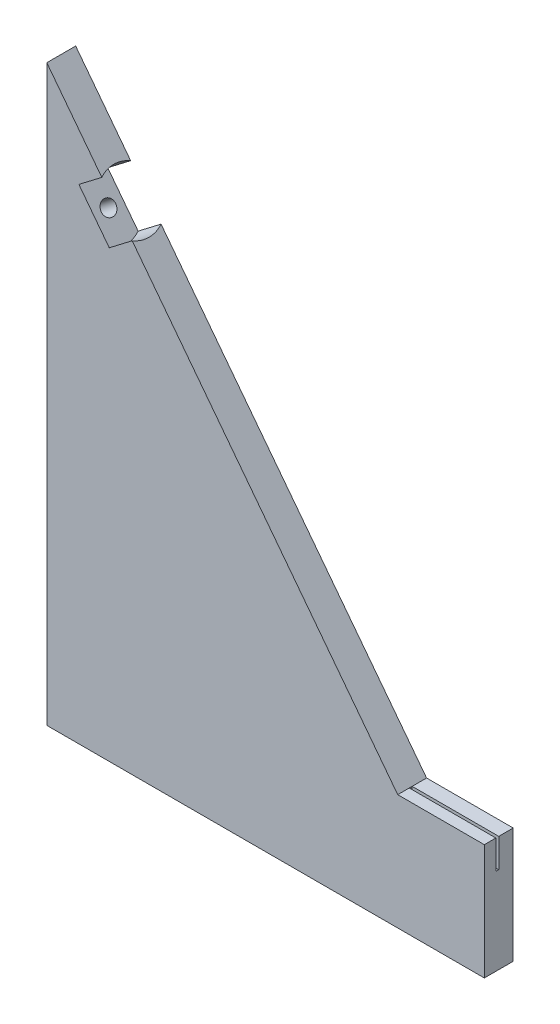
ISO-10303-21;
HEADER;
FILE_DESCRIPTION(('STEP AP214'),'2;1');
FILE_NAME('part.step','',(''),(''),'','','');
FILE_SCHEMA(('AUTOMOTIVE_DESIGN { 1 0 10303 214 1 1 1 1 }'));
ENDSEC;
DATA;
#1=APPLICATION_CONTEXT('core data for automotive mechanical design processes');
#2=APPLICATION_PROTOCOL_DEFINITION('international standard','automotive_design',2000,#1);
#3=PRODUCT_CONTEXT('',#1,'mechanical');
#4=PRODUCT('Part','Part','',(#3));
#5=PRODUCT_RELATED_PRODUCT_CATEGORY('part','',(#4));
#6=PRODUCT_DEFINITION_FORMATION('','',#4);
#7=PRODUCT_DEFINITION_CONTEXT('part definition',#1,'design');
#8=PRODUCT_DEFINITION('design','',#6,#7);
#9=PRODUCT_DEFINITION_SHAPE('','',#8);
#10=(LENGTH_UNIT() NAMED_UNIT(*) SI_UNIT(.MILLI.,.METRE.));
#11=(NAMED_UNIT(*) PLANE_ANGLE_UNIT() SI_UNIT($,.RADIAN.));
#12=(NAMED_UNIT(*) SI_UNIT($,.STERADIAN.) SOLID_ANGLE_UNIT());
#13=UNCERTAINTY_MEASURE_WITH_UNIT(LENGTH_MEASURE(1.E-05),#10,'distance_accuracy_value','');
#14=(GEOMETRIC_REPRESENTATION_CONTEXT(3) GLOBAL_UNCERTAINTY_ASSIGNED_CONTEXT((#13)) GLOBAL_UNIT_ASSIGNED_CONTEXT((#10,
#11,#12)) REPRESENTATION_CONTEXT('',''));
#15=CARTESIAN_POINT('',(0.,0.,0.));
#16=DIRECTION('',(0.,0.,1.));
#17=DIRECTION('',(1.,0.,0.));
#18=AXIS2_PLACEMENT_3D('',#15,#16,#17);
#19=CARTESIAN_POINT('',(61.7516378344646,-67.9802034253826,6.35));
#20=DIRECTION('',(-0.794096490407309,-0.60779171096914,0.));
#21=DIRECTION('',(0.60779171096914,-0.794096490407309,0.));
#22=AXIS2_PLACEMENT_3D('',#19,#20,#21);
#23=PLANE('',#22);
#24=DIRECTION('',(-0.60779171096914,0.794096490407309,0.));
#25=VECTOR('',#24,1.);
#26=CARTESIAN_POINT('',(61.7516378344646,-67.9802034253826,6.35));
#27=LINE('',#26,#25);
#28=CARTESIAN_POINT('',(-3.34240544312143,17.0669441093048,6.35));
#29=VERTEX_POINT('',#28);
#30=CARTESIAN_POINT('',(-15.4379094586162,32.8700508563456,6.35));
#31=VERTEX_POINT('',#30);
#32=EDGE_CURVE('E141',#29,#31,#27,.T.);
#33=ORIENTED_EDGE('',*,*,#32,.F.);
#34=CARTESIAN_POINT('',(0.,12.7,3.175));
#35=DIRECTION('',(0.794096490407309,0.60779171096914,0.));
#36=DIRECTION('',(-0.60779171096914,0.794096490407309,0.));
#37=AXIS2_PLACEMENT_3D('',#34,#35,#36);
#38=CIRCLE('',#37,6.35);
#39=CARTESIAN_POINT('',(-3.34240544312143,17.0669441093048,0.));
#40=VERTEX_POINT('',#39);
#41=EDGE_CURVE('E126',#40,#29,#38,.T.);
#42=ORIENTED_EDGE('',*,*,#41,.F.);
#43=DIRECTION('',(-0.60779171096914,0.794096490407309,0.));
#44=VECTOR('',#43,1.);
#45=CARTESIAN_POINT('',(61.7516378344646,-67.9802034253826,0.));
#46=LINE('',#45,#44);
#47=CARTESIAN_POINT('',(-15.4379094586162,32.8700508563456,0.));
#48=VERTEX_POINT('',#47);
#49=EDGE_CURVE('E174',#40,#48,#46,.T.);
#50=ORIENTED_EDGE('',*,*,#49,.T.);
#51=DIRECTION('',(0.,0.,-1.));
#52=VECTOR('',#51,1.);
#53=CARTESIAN_POINT('',(-15.4379094586162,32.8700508563456,6.35));
#54=LINE('',#53,#52);
#55=EDGE_CURVE('E149',#31,#48,#54,.T.);
#56=ORIENTED_EDGE('',*,*,#55,.F.);
#57=EDGE_LOOP('',(#33,#42,#50,#56));
#58=FACE_BOUND('',#57,.T.);
#59=ADVANCED_FACE('F33',(#58),#23,.F.);
#60=CARTESIAN_POINT('',(61.7516378344646,-67.9802034253826,6.35));
#61=DIRECTION('',(0.,-1.,0.));
#62=DIRECTION('',(1.,0.,0.));
#63=AXIS2_PLACEMENT_3D('',#60,#61,#62);
#64=PLANE('',#63);
#65=DIRECTION('',(0.,0.,-1.));
#66=VECTOR('',#65,1.);
#67=CARTESIAN_POINT('',(61.7516378344646,-67.9802034253826,6.35));
#68=LINE('',#67,#66);
#69=CARTESIAN_POINT('',(61.7516378344646,-67.9802034253826,3.175));
#70=VERTEX_POINT('',#69);
#71=CARTESIAN_POINT('',(61.7516378344646,-67.9802034253826,0.));
#72=VERTEX_POINT('',#71);
#73=EDGE_CURVE('E169',#70,#72,#68,.T.);
#74=ORIENTED_EDGE('',*,*,#73,.F.);
#75=DIRECTION('',(-1.,0.,0.));
#76=VECTOR('',#75,1.);
#77=CARTESIAN_POINT('',(61.7516378344646,-67.9802034253826,3.175));
#78=LINE('',#77,#76);
#79=CARTESIAN_POINT('',(80.8016378344647,-67.9802034253825,3.175));
#80=VERTEX_POINT('',#79);
#81=EDGE_CURVE('E215',#80,#70,#78,.T.);
#82=ORIENTED_EDGE('',*,*,#81,.F.);
#83=DIRECTION('',(0.,0.,-1.));
#84=VECTOR('',#83,1.);
#85=CARTESIAN_POINT('',(80.8016378344647,-67.9802034253825,6.35));
#86=LINE('',#85,#84);
#87=CARTESIAN_POINT('',(80.8016378344647,-67.9802034253825,0.));
#88=VERTEX_POINT('',#87);
#89=EDGE_CURVE('E184',#80,#88,#86,.T.);
#90=ORIENTED_EDGE('',*,*,#89,.T.);
#91=DIRECTION('',(-1.,0.,0.));
#92=VECTOR('',#91,1.);
#93=CARTESIAN_POINT('',(61.7516378344646,-67.9802034253826,0.));
#94=LINE('',#93,#92);
#95=EDGE_CURVE('E151',#88,#72,#94,.T.);
#96=ORIENTED_EDGE('',*,*,#95,.T.);
#97=EDGE_LOOP('',(#74,#82,#90,#96));
#98=FACE_BOUND('',#97,.T.);
#99=ADVANCED_FACE('F273',(#98),#64,.F.);
#100=CARTESIAN_POINT('',(3.34240544312141,8.33305589069512,0.));
#101=VERTEX_POINT('',#100);
#102=EDGE_CURVE('E170',#72,#101,#46,.T.);
#103=ORIENTED_EDGE('',*,*,#102,.T.);
#104=CARTESIAN_POINT('',(3.34240544312141,8.33305589069512,6.35));
#105=VERTEX_POINT('',#104);
#106=EDGE_CURVE('E136',#105,#101,#38,.T.);
#107=ORIENTED_EDGE('',*,*,#106,.F.);
#108=CARTESIAN_POINT('',(61.7516378344646,-67.9802034253826,6.35));
#109=VERTEX_POINT('',#108);
#110=EDGE_CURVE('E150',#109,#105,#27,.T.);
#111=ORIENTED_EDGE('',*,*,#110,.F.);
#112=CARTESIAN_POINT('',(61.7516378344646,-67.9802034253826,3.81));
#113=VERTEX_POINT('',#112);
#114=EDGE_CURVE('E181',#109,#113,#68,.T.);
#115=ORIENTED_EDGE('',*,*,#114,.T.);
#116=DIRECTION('',(0.,0.,1.));
#117=VECTOR('',#116,1.);
#118=CARTESIAN_POINT('',(61.7516378344646,-67.9802034253826,3.81));
#119=LINE('',#118,#117);
#120=EDGE_CURVE('E56',#70,#113,#119,.T.);
#121=ORIENTED_EDGE('',*,*,#120,.F.);
#122=ORIENTED_EDGE('',*,*,#73,.T.);
#123=EDGE_LOOP('',(#103,#107,#111,#115,#121,#122));
#124=FACE_BOUND('',#123,.T.);
#125=ADVANCED_FACE('F35',(#124),#23,.F.);
#126=CARTESIAN_POINT('',(-15.4379094586162,32.8700508563456,6.35));
#127=DIRECTION('',(1.,0.,0.));
#128=DIRECTION('',(0.,1.,0.));
#129=AXIS2_PLACEMENT_3D('',#126,#127,#128);
#130=PLANE('',#129);
#131=DIRECTION('',(0.,-1.,0.));
#132=VECTOR('',#131,1.);
#133=CARTESIAN_POINT('',(-15.4379094586162,32.8700508563456,0.));
#134=LINE('',#133,#132);
#135=CARTESIAN_POINT('',(-15.4379094586162,-93.3802034253826,0.));
#136=VERTEX_POINT('',#135);
#137=EDGE_CURVE('E173',#48,#136,#134,.T.);
#138=ORIENTED_EDGE('',*,*,#137,.T.);
#139=DIRECTION('',(0.,0.,-1.));
#140=VECTOR('',#139,1.);
#141=CARTESIAN_POINT('',(-15.4379094586162,-93.3802034253826,6.35));
#142=LINE('',#141,#140);
#143=CARTESIAN_POINT('',(-15.4379094586162,-93.3802034253826,6.35));
#144=VERTEX_POINT('',#143);
#145=EDGE_CURVE('E191',#144,#136,#142,.T.);
#146=ORIENTED_EDGE('',*,*,#145,.F.);
#147=DIRECTION('',(0.,-1.,0.));
#148=VECTOR('',#147,1.);
#149=CARTESIAN_POINT('',(-15.4379094586162,32.8700508563456,6.35));
#150=LINE('',#149,#148);
#151=EDGE_CURVE('E154',#31,#144,#150,.T.);
#152=ORIENTED_EDGE('',*,*,#151,.F.);
#153=ORIENTED_EDGE('',*,*,#55,.T.);
#154=EDGE_LOOP('',(#138,#146,#152,#153));
#155=FACE_BOUND('',#154,.T.);
#156=ADVANCED_FACE('F258',(#155),#130,.F.);
#157=CARTESIAN_POINT('',(80.8016378344647,-93.3802034253825,6.35));
#158=DIRECTION('',(0.,1.,0.));
#159=DIRECTION('',(-1.,0.,0.));
#160=AXIS2_PLACEMENT_3D('',#157,#158,#159);
#161=PLANE('',#160);
#162=CARTESIAN_POINT('',(68.1016378344647,-93.3802034253828,3.175));
#163=DIRECTION('',(0.,-1.,0.));
#164=DIRECTION('',(0.,0.,-1.));
#165=AXIS2_PLACEMENT_3D('',#162,#163,#164);
#166=CIRCLE('',#165,1.5875);
#167=CARTESIAN_POINT('',(68.1016378344647,-93.3802034253828,1.5875));
#168=VERTEX_POINT('',#167);
#169=EDGE_CURVE('E240',#168,#168,#166,.T.);
#170=ORIENTED_EDGE('',*,*,#169,.F.);
#171=EDGE_LOOP('',(#170));
#172=FACE_BOUND('',#171,.T.);
#173=CARTESIAN_POINT('',(-8.09836216553531,-93.3802034253828,3.175));
#174=DIRECTION('',(0.,-1.,0.));
#175=DIRECTION('',(0.,0.,-1.));
#176=AXIS2_PLACEMENT_3D('',#173,#174,#175);
#177=CIRCLE('',#176,1.5875);
#178=CARTESIAN_POINT('',(-8.09836216553531,-93.3802034253828,1.5875));
#179=VERTEX_POINT('',#178);
#180=EDGE_CURVE('E160',#179,#179,#177,.T.);
#181=ORIENTED_EDGE('',*,*,#180,.F.);
#182=EDGE_LOOP('',(#181));
#183=FACE_BOUND('',#182,.T.);
#184=DIRECTION('',(1.,0.,0.));
#185=VECTOR('',#184,1.);
#186=CARTESIAN_POINT('',(80.8016378344647,-93.3802034253825,0.));
#187=LINE('',#186,#185);
#188=CARTESIAN_POINT('',(80.8016378344647,-93.3802034253825,0.));
#189=VERTEX_POINT('',#188);
#190=EDGE_CURVE('E177',#136,#189,#187,.T.);
#191=ORIENTED_EDGE('',*,*,#190,.T.);
#192=DIRECTION('',(0.,0.,-1.));
#193=VECTOR('',#192,1.);
#194=CARTESIAN_POINT('',(80.8016378344647,-93.3802034253825,6.35));
#195=LINE('',#194,#193);
#196=CARTESIAN_POINT('',(80.8016378344647,-93.3802034253825,6.35));
#197=VERTEX_POINT('',#196);
#198=EDGE_CURVE('E188',#197,#189,#195,.T.);
#199=ORIENTED_EDGE('',*,*,#198,.F.);
#200=DIRECTION('',(1.,0.,0.));
#201=VECTOR('',#200,1.);
#202=CARTESIAN_POINT('',(-15.4379094586162,-93.3802034253826,6.35));
#203=LINE('',#202,#201);
#204=EDGE_CURVE('E163',#144,#197,#203,.T.);
#205=ORIENTED_EDGE('',*,*,#204,.F.);
#206=ORIENTED_EDGE('',*,*,#145,.T.);
#207=EDGE_LOOP('',(#191,#199,#205,#206));
#208=FACE_BOUND('',#207,.T.);
#209=ADVANCED_FACE('F254',(#172,#183,#208),#161,.F.);
#210=CARTESIAN_POINT('',(80.8016378344647,-67.9802034253825,6.35));
#211=DIRECTION('',(-1.,0.,0.));
#212=DIRECTION('',(0.,0.,1.));
#213=AXIS2_PLACEMENT_3D('',#210,#211,#212);
#214=PLANE('',#213);
#215=ORIENTED_EDGE('',*,*,#89,.F.);
#216=DIRECTION('',(0.,1.,0.));
#217=VECTOR('',#216,1.);
#218=CARTESIAN_POINT('',(80.8016378344647,-74.3302034253825,3.175));
#219=LINE('',#218,#217);
#220=CARTESIAN_POINT('',(80.8016378344647,-74.3302034253825,3.175));
#221=VERTEX_POINT('',#220);
#222=EDGE_CURVE('E232',#221,#80,#219,.T.);
#223=ORIENTED_EDGE('',*,*,#222,.F.);
#224=DIRECTION('',(0.,0.,-1.));
#225=VECTOR('',#224,1.);
#226=CARTESIAN_POINT('',(80.8016378344647,-74.3302034253825,3.81));
#227=LINE('',#226,#225);
#228=CARTESIAN_POINT('',(80.8016378344647,-74.3302034253825,3.81));
#229=VERTEX_POINT('',#228);
#230=EDGE_CURVE('E218',#229,#221,#227,.T.);
#231=ORIENTED_EDGE('',*,*,#230,.F.);
#232=DIRECTION('',(0.,1.,0.));
#233=VECTOR('',#232,1.);
#234=CARTESIAN_POINT('',(80.8016378344647,-74.3302034253825,3.81));
#235=LINE('',#234,#233);
#236=CARTESIAN_POINT('',(80.8016378344647,-67.9802034253825,3.81));
#237=VERTEX_POINT('',#236);
#238=EDGE_CURVE('E234',#229,#237,#235,.T.);
#239=ORIENTED_EDGE('',*,*,#238,.T.);
#240=CARTESIAN_POINT('',(80.8016378344647,-67.9802034253825,6.35));
#241=VERTEX_POINT('',#240);
#242=EDGE_CURVE('E185',#241,#237,#86,.T.);
#243=ORIENTED_EDGE('',*,*,#242,.F.);
#244=DIRECTION('',(0.,1.,0.));
#245=VECTOR('',#244,1.);
#246=CARTESIAN_POINT('',(80.8016378344647,-67.9802034253825,6.35));
#247=LINE('',#246,#245);
#248=EDGE_CURVE('E165',#197,#241,#247,.T.);
#249=ORIENTED_EDGE('',*,*,#248,.F.);
#250=ORIENTED_EDGE('',*,*,#198,.T.);
#251=DIRECTION('',(0.,1.,0.));
#252=VECTOR('',#251,1.);
#253=CARTESIAN_POINT('',(80.8016378344647,-67.9802034253825,0.));
#254=LINE('',#253,#252);
#255=EDGE_CURVE('E156',#189,#88,#254,.T.);
#256=ORIENTED_EDGE('',*,*,#255,.T.);
#257=EDGE_LOOP('',(#215,#223,#231,#239,#243,#249,#250,#256));
#258=FACE_BOUND('',#257,.T.);
#259=ADVANCED_FACE('F257',(#258),#214,.F.);
#260=ORIENTED_EDGE('',*,*,#242,.T.);
#261=DIRECTION('',(1.,0.,0.));
#262=VECTOR('',#261,1.);
#263=CARTESIAN_POINT('',(61.7516378344646,-67.9802034253826,3.81));
#264=LINE('',#263,#262);
#265=EDGE_CURVE('E225',#113,#237,#264,.T.);
#266=ORIENTED_EDGE('',*,*,#265,.F.);
#267=ORIENTED_EDGE('',*,*,#114,.F.);
#268=DIRECTION('',(-1.,0.,0.));
#269=VECTOR('',#268,1.);
#270=CARTESIAN_POINT('',(61.7516378344646,-67.9802034253826,6.35));
#271=LINE('',#270,#269);
#272=EDGE_CURVE('E167',#241,#109,#271,.T.);
#273=ORIENTED_EDGE('',*,*,#272,.F.);
#274=EDGE_LOOP('',(#260,#266,#267,#273));
#275=FACE_BOUND('',#274,.T.);
#276=ADVANCED_FACE('F289',(#275),#64,.F.);
#277=CARTESIAN_POINT('',(81.1924862012642,-93.3802034253826,6.35));
#278=DIRECTION('',(0.,0.,-1.));
#279=DIRECTION('',(-1.,0.,0.));
#280=AXIS2_PLACEMENT_3D('',#277,#278,#279);
#281=PLANE('',#280);
#282=DIRECTION('',(0.60779171096914,-0.794096490407309,0.));
#283=VECTOR('',#282,1.);
#284=CARTESIAN_POINT('',(76.1499734871777,-97.2396807900366,6.35));
#285=LINE('',#284,#283);
#286=CARTESIAN_POINT('',(-8.38491815720784,13.2074667446508,6.35));
#287=VERTEX_POINT('',#286);
#288=CARTESIAN_POINT('',(-1.700107270965,4.47357852604108,6.35));
#289=VERTEX_POINT('',#288);
#290=EDGE_CURVE('E144',#287,#289,#285,.T.);
#291=ORIENTED_EDGE('',*,*,#290,.F.);
#292=DIRECTION('',(0.794096490407309,0.60779171096914,0.));
#293=VECTOR('',#292,1.);
#294=CARTESIAN_POINT('',(-8.38491815720784,13.2074667446508,6.35));
#295=LINE('',#294,#293);
#296=EDGE_CURVE('E130',#287,#29,#295,.T.);
#297=ORIENTED_EDGE('',*,*,#296,.T.);
#298=ORIENTED_EDGE('',*,*,#32,.T.);
#299=ORIENTED_EDGE('',*,*,#151,.T.);
#300=ORIENTED_EDGE('',*,*,#204,.T.);
#301=ORIENTED_EDGE('',*,*,#248,.T.);
#302=ORIENTED_EDGE('',*,*,#272,.T.);
#303=ORIENTED_EDGE('',*,*,#110,.T.);
#304=DIRECTION('',(0.794096490407309,0.60779171096914,0.));
#305=VECTOR('',#304,1.);
#306=CARTESIAN_POINT('',(-1.70010727096501,4.47357852604108,6.35));
#307=LINE('',#306,#305);
#308=EDGE_CURVE('E145',#105,#289,#307,.F.);
#309=ORIENTED_EDGE('',*,*,#308,.T.);
#310=EDGE_LOOP('',(#291,#297,#298,#299,#300,#301,#302,#303,#309));
#311=FACE_BOUND('',#310,.T.);
#312=ADVANCED_FACE('F140',(#311),#281,.F.);
#313=CARTESIAN_POINT('',(81.1924862012642,-93.3802034253826,0.));
#314=DIRECTION('',(0.,0.,-1.));
#315=DIRECTION('',(-1.,0.,0.));
#316=AXIS2_PLACEMENT_3D('',#313,#314,#315);
#317=PLANE('',#316);
#318=DIRECTION('',(0.794096490407309,0.60779171096914,0.));
#319=VECTOR('',#318,1.);
#320=CARTESIAN_POINT('',(-8.38491815720784,13.2074667446508,0.));
#321=LINE('',#320,#319);
#322=CARTESIAN_POINT('',(-8.38491815720784,13.2074667446508,0.));
#323=VERTEX_POINT('',#322);
#324=EDGE_CURVE('E11',#323,#40,#321,.T.);
#325=ORIENTED_EDGE('',*,*,#324,.F.);
#326=DIRECTION('',(0.60779171096914,-0.794096490407309,0.));
#327=VECTOR('',#326,1.);
#328=CARTESIAN_POINT('',(76.1499734871777,-97.2396807900366,0.));
#329=LINE('',#328,#327);
#330=CARTESIAN_POINT('',(-1.700107270965,4.47357852604108,0.));
#331=VERTEX_POINT('',#330);
#332=EDGE_CURVE('E197',#323,#331,#329,.T.);
#333=ORIENTED_EDGE('',*,*,#332,.T.);
#334=DIRECTION('',(0.794096490407309,0.60779171096914,0.));
#335=VECTOR('',#334,1.);
#336=CARTESIAN_POINT('',(-1.70010727096501,4.47357852604108,0.));
#337=LINE('',#336,#335);
#338=EDGE_CURVE('E41',#101,#331,#337,.F.);
#339=ORIENTED_EDGE('',*,*,#338,.F.);
#340=ORIENTED_EDGE('',*,*,#102,.F.);
#341=ORIENTED_EDGE('',*,*,#95,.F.);
#342=ORIENTED_EDGE('',*,*,#255,.F.);
#343=ORIENTED_EDGE('',*,*,#190,.F.);
#344=ORIENTED_EDGE('',*,*,#137,.F.);
#345=ORIENTED_EDGE('',*,*,#49,.F.);
#346=EDGE_LOOP('',(#325,#333,#339,#340,#341,#342,#343,#344,#345));
#347=FACE_BOUND('',#346,.T.);
#348=ADVANCED_FACE('F205',(#347),#317,.T.);
#349=CARTESIAN_POINT('',(-8.09836216553531,-80.6802034253828,3.175));
#350=DIRECTION('',(0.,-1.,0.));
#351=DIRECTION('',(0.,0.,-1.));
#352=AXIS2_PLACEMENT_3D('',#349,#350,#351);
#353=CYLINDRICAL_SURFACE('',#352,1.5875);
#354=CARTESIAN_POINT('',(-8.09836216553531,-80.6802034253828,3.175));
#355=DIRECTION('',(0.,-1.,0.));
#356=DIRECTION('',(0.,0.,-1.));
#357=AXIS2_PLACEMENT_3D('',#354,#355,#356);
#358=CIRCLE('',#357,1.5875);
#359=CARTESIAN_POINT('',(-8.09836216553531,-80.6802034253828,1.5875));
#360=VERTEX_POINT('',#359);
#361=EDGE_CURVE('E245',#360,#360,#358,.T.);
#362=ORIENTED_EDGE('',*,*,#361,.F.);
#363=EDGE_LOOP('',(#362));
#364=FACE_BOUND('',#363,.T.);
#365=ORIENTED_EDGE('',*,*,#180,.T.);
#366=EDGE_LOOP('',(#365));
#367=FACE_BOUND('',#366,.T.);
#368=ADVANCED_FACE('F252',(#364,#367),#353,.F.);
#369=CARTESIAN_POINT('',(-8.09836216553531,-80.6802034253828,3.175));
#370=DIRECTION('',(0.,-1.,0.));
#371=DIRECTION('',(0.,0.,-1.));
#372=AXIS2_PLACEMENT_3D('',#369,#370,#371);
#373=PLANE('',#372);
#374=ORIENTED_EDGE('',*,*,#361,.T.);
#375=EDGE_LOOP('',(#374));
#376=FACE_BOUND('',#375,.T.);
#377=ADVANCED_FACE('F331',(#376),#373,.T.);
#378=CARTESIAN_POINT('',(68.1016378344647,-80.6802034253828,3.175));
#379=DIRECTION('',(0.,-1.,0.));
#380=DIRECTION('',(0.,0.,-1.));
#381=AXIS2_PLACEMENT_3D('',#378,#379,#380);
#382=CYLINDRICAL_SURFACE('',#381,1.5875);
#383=CARTESIAN_POINT('',(68.1016378344647,-80.6802034253828,3.175));
#384=DIRECTION('',(0.,-1.,0.));
#385=DIRECTION('',(0.,0.,-1.));
#386=AXIS2_PLACEMENT_3D('',#383,#384,#385);
#387=CIRCLE('',#386,1.5875);
#388=CARTESIAN_POINT('',(68.1016378344647,-80.6802034253828,1.5875));
#389=VERTEX_POINT('',#388);
#390=EDGE_CURVE('E241',#389,#389,#387,.T.);
#391=ORIENTED_EDGE('',*,*,#390,.F.);
#392=EDGE_LOOP('',(#391));
#393=FACE_BOUND('',#392,.T.);
#394=ORIENTED_EDGE('',*,*,#169,.T.);
#395=EDGE_LOOP('',(#394));
#396=FACE_BOUND('',#395,.T.);
#397=ADVANCED_FACE('F343',(#393,#396),#382,.F.);
#398=CARTESIAN_POINT('',(68.1016378344647,-80.6802034253828,3.175));
#399=DIRECTION('',(0.,-1.,0.));
#400=DIRECTION('',(0.,0.,-1.));
#401=AXIS2_PLACEMENT_3D('',#398,#399,#400);
#402=PLANE('',#401);
#403=ORIENTED_EDGE('',*,*,#390,.T.);
#404=EDGE_LOOP('',(#403));
#405=FACE_BOUND('',#404,.T.);
#406=ADVANCED_FACE('F352',(#405),#402,.T.);
#407=CARTESIAN_POINT('',(61.7516378344646,-74.3302034253826,3.81));
#408=DIRECTION('',(-1.,0.,0.));
#409=DIRECTION('',(0.,-1.,0.));
#410=AXIS2_PLACEMENT_3D('',#407,#408,#409);
#411=PLANE('',#410);
#412=ORIENTED_EDGE('',*,*,#120,.T.);
#413=DIRECTION('',(0.,1.,0.));
#414=VECTOR('',#413,1.);
#415=CARTESIAN_POINT('',(61.7516378344646,-74.3302034253826,3.81));
#416=LINE('',#415,#414);
#417=CARTESIAN_POINT('',(61.7516378344646,-74.3302034253826,3.81));
#418=VERTEX_POINT('',#417);
#419=EDGE_CURVE('E223',#418,#113,#416,.T.);
#420=ORIENTED_EDGE('',*,*,#419,.F.);
#421=DIRECTION('',(0.,0.,1.));
#422=VECTOR('',#421,1.);
#423=CARTESIAN_POINT('',(61.7516378344646,-74.3302034253826,3.81));
#424=LINE('',#423,#422);
#425=CARTESIAN_POINT('',(61.7516378344646,-74.3302034253826,3.175));
#426=VERTEX_POINT('',#425);
#427=EDGE_CURVE('E211',#426,#418,#424,.T.);
#428=ORIENTED_EDGE('',*,*,#427,.F.);
#429=DIRECTION('',(0.,1.,0.));
#430=VECTOR('',#429,1.);
#431=CARTESIAN_POINT('',(61.7516378344646,-74.3302034253826,3.175));
#432=LINE('',#431,#430);
#433=EDGE_CURVE('E229',#426,#70,#432,.T.);
#434=ORIENTED_EDGE('',*,*,#433,.T.);
#435=EDGE_LOOP('',(#412,#420,#428,#434));
#436=FACE_BOUND('',#435,.T.);
#437=ADVANCED_FACE('F362',(#436),#411,.F.);
#438=CARTESIAN_POINT('',(61.7516378344646,-74.3302034253826,3.175));
#439=DIRECTION('',(0.,0.,-1.));
#440=DIRECTION('',(-1.,0.,0.));
#441=AXIS2_PLACEMENT_3D('',#438,#439,#440);
#442=PLANE('',#441);
#443=ORIENTED_EDGE('',*,*,#81,.T.);
#444=ORIENTED_EDGE('',*,*,#433,.F.);
#445=DIRECTION('',(-1.,0.,0.));
#446=VECTOR('',#445,1.);
#447=CARTESIAN_POINT('',(61.7516378344646,-74.3302034253826,3.175));
#448=LINE('',#447,#446);
#449=EDGE_CURVE('E220',#221,#426,#448,.T.);
#450=ORIENTED_EDGE('',*,*,#449,.F.);
#451=ORIENTED_EDGE('',*,*,#222,.T.);
#452=EDGE_LOOP('',(#443,#444,#450,#451));
#453=FACE_BOUND('',#452,.T.);
#454=ADVANCED_FACE('F279',(#453),#442,.F.);
#455=CARTESIAN_POINT('',(61.7516378344646,-74.3302034253826,3.81));
#456=DIRECTION('',(0.,0.,1.));
#457=DIRECTION('',(1.,0.,0.));
#458=AXIS2_PLACEMENT_3D('',#455,#456,#457);
#459=PLANE('',#458);
#460=ORIENTED_EDGE('',*,*,#265,.T.);
#461=ORIENTED_EDGE('',*,*,#238,.F.);
#462=DIRECTION('',(1.,0.,0.));
#463=VECTOR('',#462,1.);
#464=CARTESIAN_POINT('',(61.7516378344646,-74.3302034253826,3.81));
#465=LINE('',#464,#463);
#466=EDGE_CURVE('E214',#418,#229,#465,.T.);
#467=ORIENTED_EDGE('',*,*,#466,.F.);
#468=ORIENTED_EDGE('',*,*,#419,.T.);
#469=EDGE_LOOP('',(#460,#461,#467,#468));
#470=FACE_BOUND('',#469,.T.);
#471=ADVANCED_FACE('F285',(#470),#459,.F.);
#472=CARTESIAN_POINT('',(61.7516378344646,-74.3302034253826,3.175));
#473=DIRECTION('',(0.,-1.,0.));
#474=DIRECTION('',(1.,0.,0.));
#475=AXIS2_PLACEMENT_3D('',#472,#473,#474);
#476=PLANE('',#475);
#477=ORIENTED_EDGE('',*,*,#427,.T.);
#478=ORIENTED_EDGE('',*,*,#466,.T.);
#479=ORIENTED_EDGE('',*,*,#230,.T.);
#480=ORIENTED_EDGE('',*,*,#449,.T.);
#481=EDGE_LOOP('',(#477,#478,#479,#480));
#482=FACE_BOUND('',#481,.T.);
#483=ADVANCED_FACE('F282',(#482),#476,.F.);
#484=CARTESIAN_POINT('',(-5.04251271408642,8.84052263534593,3.175));
#485=DIRECTION('',(0.794096490407309,0.60779171096914,0.));
#486=DIRECTION('',(-0.60779171096914,0.794096490407309,0.));
#487=AXIS2_PLACEMENT_3D('',#484,#485,#486);
#488=CYLINDRICAL_SURFACE('',#487,6.35);
#489=CARTESIAN_POINT('',(-5.04251271408642,8.84052263534593,3.175));
#490=DIRECTION('',(0.794096490407309,0.60779171096914,0.));
#491=DIRECTION('',(-0.60779171096914,0.794096490407309,0.));
#492=AXIS2_PLACEMENT_3D('',#489,#490,#491);
#493=CIRCLE('',#492,6.35);
#494=EDGE_CURVE('E479',#323,#287,#493,.T.);
#495=ORIENTED_EDGE('',*,*,#494,.F.);
#496=ORIENTED_EDGE('',*,*,#324,.T.);
#497=ORIENTED_EDGE('',*,*,#41,.T.);
#498=ORIENTED_EDGE('',*,*,#296,.F.);
#499=EDGE_LOOP('',(#495,#496,#497,#498));
#500=FACE_BOUND('',#499,.T.);
#501=ADVANCED_FACE('F129',(#500),#488,.F.);
#502=ORIENTED_EDGE('',*,*,#106,.T.);
#503=ORIENTED_EDGE('',*,*,#338,.T.);
#504=EDGE_CURVE('E48',#289,#331,#493,.T.);
#505=ORIENTED_EDGE('',*,*,#504,.F.);
#506=ORIENTED_EDGE('',*,*,#308,.F.);
#507=EDGE_LOOP('',(#502,#503,#505,#506));
#508=FACE_BOUND('',#507,.T.);
#509=ADVANCED_FACE('F201',(#508),#488,.F.);
#510=CARTESIAN_POINT('',(-5.04251271408642,8.84052263534593,3.175));
#511=DIRECTION('',(0.794096490407309,0.60779171096914,0.));
#512=DIRECTION('',(-0.60779171096914,0.794096490407309,0.));
#513=AXIS2_PLACEMENT_3D('',#510,#511,#512);
#514=PLANE('',#513);
#515=CARTESIAN_POINT('',(-5.04251271408642,8.84052263534593,3.175));
#516=DIRECTION('',(0.794096490407309,0.60779171096914,0.));
#517=DIRECTION('',(-0.60779171096914,0.794096490407309,0.));
#518=AXIS2_PLACEMENT_3D('',#515,#516,#517);
#519=CIRCLE('',#518,1.5875);
#520=CARTESIAN_POINT('',(-6.00738205524993,10.1011508138675,3.175));
#521=VERTEX_POINT('',#520);
#522=EDGE_CURVE('E195',#521,#521,#519,.F.);
#523=ORIENTED_EDGE('',*,*,#522,.T.);
#524=EDGE_LOOP('',(#523));
#525=FACE_BOUND('',#524,.T.);
#526=ORIENTED_EDGE('',*,*,#290,.T.);
#527=ORIENTED_EDGE('',*,*,#504,.T.);
#528=ORIENTED_EDGE('',*,*,#332,.F.);
#529=ORIENTED_EDGE('',*,*,#494,.T.);
#530=EDGE_LOOP('',(#526,#527,#528,#529));
#531=FACE_BOUND('',#530,.T.);
#532=ADVANCED_FACE('F374',(#525,#531),#514,.T.);
#533=CARTESIAN_POINT('',(-10.0850254281728,4.98104527069188,3.175));
#534=DIRECTION('',(0.794096490407309,0.60779171096914,0.));
#535=DIRECTION('',(-0.60779171096914,0.794096490407309,0.));
#536=AXIS2_PLACEMENT_3D('',#533,#534,#535);
#537=PLANE('',#536);
#538=CARTESIAN_POINT('',(-10.0850254281728,4.98104527069188,3.175));
#539=DIRECTION('',(0.794096490407309,0.60779171096914,0.));
#540=DIRECTION('',(-0.60779171096914,0.794096490407309,0.));
#541=AXIS2_PLACEMENT_3D('',#538,#539,#540);
#542=CIRCLE('',#541,1.5875);
#543=CARTESIAN_POINT('',(-11.0498947693363,6.24167344921349,3.175));
#544=VERTEX_POINT('',#543);
#545=EDGE_CURVE('E231',#544,#544,#542,.T.);
#546=ORIENTED_EDGE('',*,*,#545,.T.);
#547=EDGE_LOOP('',(#546));
#548=FACE_BOUND('',#547,.T.);
#549=ADVANCED_FACE('F370',(#548),#537,.T.);
#550=CARTESIAN_POINT('',(-10.0850254281728,4.98104527069188,3.175));
#551=DIRECTION('',(0.794096490407309,0.60779171096914,0.));
#552=DIRECTION('',(-0.60779171096914,0.794096490407309,0.));
#553=AXIS2_PLACEMENT_3D('',#550,#551,#552);
#554=CYLINDRICAL_SURFACE('',#553,1.5875);
#555=ORIENTED_EDGE('',*,*,#545,.F.);
#556=EDGE_LOOP('',(#555));
#557=FACE_BOUND('',#556,.T.);
#558=ORIENTED_EDGE('',*,*,#522,.F.);
#559=EDGE_LOOP('',(#558));
#560=FACE_BOUND('',#559,.T.);
#561=ADVANCED_FACE('F373',(#557,#560),#554,.F.);
#562=CLOSED_SHELL('',(#59,#99,#125,#156,#209,#259,#276,#312,#348,#368,#377,#397,#406,#437,#454,
#471,#483,#501,#509,#532,#549,#561));
#563=MANIFOLD_SOLID_BREP('B2',#562);
#564=ADVANCED_BREP_SHAPE_REPRESENTATION('',(#18,#563),#14);
#565=SHAPE_DEFINITION_REPRESENTATION(#9,#564);
ENDSEC;
END-ISO-10303-21;
